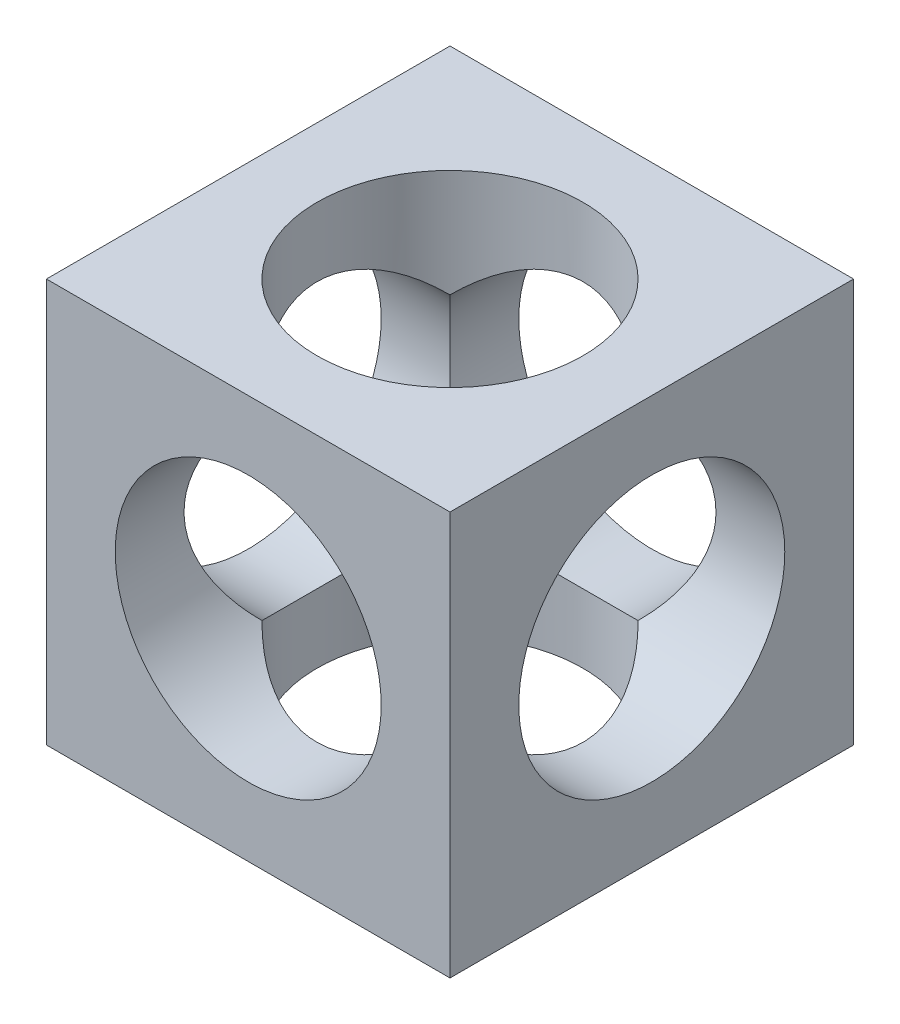
ISO-10303-21;
HEADER;
FILE_DESCRIPTION(('STEP AP214'),'2;1');
FILE_NAME('part.step','',(''),(''),'','','');
FILE_SCHEMA(('AUTOMOTIVE_DESIGN { 1 0 10303 214 1 1 1 1 }'));
ENDSEC;
DATA;
#1=APPLICATION_CONTEXT('core data for automotive mechanical design processes');
#2=APPLICATION_PROTOCOL_DEFINITION('international standard','automotive_design',2000,#1);
#3=PRODUCT_CONTEXT('',#1,'mechanical');
#4=PRODUCT('Part','Part','',(#3));
#5=PRODUCT_RELATED_PRODUCT_CATEGORY('part','',(#4));
#6=PRODUCT_DEFINITION_FORMATION('','',#4);
#7=PRODUCT_DEFINITION_CONTEXT('part definition',#1,'design');
#8=PRODUCT_DEFINITION('design','',#6,#7);
#9=PRODUCT_DEFINITION_SHAPE('','',#8);
#10=(LENGTH_UNIT() NAMED_UNIT(*) SI_UNIT(.MILLI.,.METRE.));
#11=(NAMED_UNIT(*) PLANE_ANGLE_UNIT() SI_UNIT($,.RADIAN.));
#12=(NAMED_UNIT(*) SI_UNIT($,.STERADIAN.) SOLID_ANGLE_UNIT());
#13=UNCERTAINTY_MEASURE_WITH_UNIT(LENGTH_MEASURE(1.E-05),#10,'distance_accuracy_value','');
#14=(GEOMETRIC_REPRESENTATION_CONTEXT(3) GLOBAL_UNCERTAINTY_ASSIGNED_CONTEXT((#13)) GLOBAL_UNIT_ASSIGNED_CONTEXT((#10,
#11,#12)) REPRESENTATION_CONTEXT('',''));
#15=CARTESIAN_POINT('',(0.,0.,0.));
#16=DIRECTION('',(0.,0.,1.));
#17=DIRECTION('',(1.,0.,0.));
#18=AXIS2_PLACEMENT_3D('',#15,#16,#17);
#19=CARTESIAN_POINT('',(-11.,11.,22.));
#20=DIRECTION('',(0.,-1.,0.));
#21=DIRECTION('',(0.,0.,-1.));
#22=AXIS2_PLACEMENT_3D('',#19,#20,#21);
#23=PLANE('',#22);
#24=DIRECTION('',(-1.,0.,0.));
#25=VECTOR('',#24,1.);
#26=CARTESIAN_POINT('',(-11.,11.,0.));
#27=LINE('',#26,#25);
#28=CARTESIAN_POINT('',(11.,11.,0.));
#29=VERTEX_POINT('',#28);
#30=CARTESIAN_POINT('',(-11.,11.,0.));
#31=VERTEX_POINT('',#30);
#32=EDGE_CURVE('E138',#29,#31,#27,.T.);
#33=ORIENTED_EDGE('',*,*,#32,.T.);
#34=DIRECTION('',(0.,0.,-1.));
#35=VECTOR('',#34,1.);
#36=CARTESIAN_POINT('',(-11.,11.,22.));
#37=LINE('',#36,#35);
#38=CARTESIAN_POINT('',(-11.,11.,22.));
#39=VERTEX_POINT('',#38);
#40=EDGE_CURVE('E123',#39,#31,#37,.T.);
#41=ORIENTED_EDGE('',*,*,#40,.F.);
#42=DIRECTION('',(-1.,0.,0.));
#43=VECTOR('',#42,1.);
#44=CARTESIAN_POINT('',(-11.,11.,22.));
#45=LINE('',#44,#43);
#46=CARTESIAN_POINT('',(11.,11.,22.));
#47=VERTEX_POINT('',#46);
#48=EDGE_CURVE('E147',#47,#39,#45,.T.);
#49=ORIENTED_EDGE('',*,*,#48,.F.);
#50=DIRECTION('',(0.,0.,-1.));
#51=VECTOR('',#50,1.);
#52=CARTESIAN_POINT('',(11.,11.,22.));
#53=LINE('',#52,#51);
#54=EDGE_CURVE('E120',#47,#29,#53,.T.);
#55=ORIENTED_EDGE('',*,*,#54,.T.);
#56=EDGE_LOOP('',(#33,#41,#49,#55));
#57=FACE_BOUND('',#56,.T.);
#58=CARTESIAN_POINT('',(0.,11.,11.));
#59=DIRECTION('',(0.,1.,0.));
#60=DIRECTION('',(0.,0.,1.));
#61=AXIS2_PLACEMENT_3D('',#58,#59,#60);
#62=CIRCLE('',#61,7.25);
#63=CARTESIAN_POINT('',(0.,11.,18.25));
#64=VERTEX_POINT('',#63);
#65=EDGE_CURVE('E174',#64,#64,#62,.T.);
#66=ORIENTED_EDGE('',*,*,#65,.F.);
#67=EDGE_LOOP('',(#66));
#68=FACE_BOUND('',#67,.T.);
#69=ADVANCED_FACE('F32',(#57,#68),#23,.F.);
#70=CARTESIAN_POINT('',(11.,0.,11.));
#71=DIRECTION('',(1.,0.,0.));
#72=DIRECTION('',(0.,0.,-1.));
#73=AXIS2_PLACEMENT_3D('',#70,#71,#72);
#74=CYLINDRICAL_SURFACE('',#73,7.25);
#75=CARTESIAN_POINT('',(11.,0.,11.));
#76=DIRECTION('',(1.,0.,0.));
#77=DIRECTION('',(0.,0.,-1.));
#78=AXIS2_PLACEMENT_3D('',#75,#76,#77);
#79=CIRCLE('',#78,7.25);
#80=CARTESIAN_POINT('',(11.,0.,3.75));
#81=VERTEX_POINT('',#80);
#82=EDGE_CURVE('E153',#81,#81,#79,.T.);
#83=ORIENTED_EDGE('',*,*,#82,.T.);
#84=EDGE_LOOP('',(#83));
#85=FACE_BOUND('',#84,.T.);
#86=CARTESIAN_POINT('',(0.,0.,11.));
#87=DIRECTION('',(0.707106781186547,0.,0.707106781186547));
#88=DIRECTION('',(0.707106781186547,0.,-0.707106781186547));
#89=AXIS2_PLACEMENT_3D('',#86,#87,#88);
#90=ELLIPSE('',#89,10.2530483272049,7.25);
#91=CARTESIAN_POINT('',(5.12652416360253,5.12652416360253,5.87347583639757));
#92=VERTEX_POINT('',#91);
#93=CARTESIAN_POINT('',(5.1265241636025,-5.1265241636025,5.87347583639759));
#94=VERTEX_POINT('',#93);
#95=EDGE_CURVE('E101',#92,#94,#90,.F.);
#96=ORIENTED_EDGE('',*,*,#95,.T.);
#97=CARTESIAN_POINT('',(0.,0.,11.));
#98=DIRECTION('',(0.707106781186547,0.707106781186547,0.));
#99=DIRECTION('',(0.707106781186547,-0.707106781186547,0.));
#100=AXIS2_PLACEMENT_3D('',#97,#98,#99);
#101=ELLIPSE('',#100,10.2530483272049,7.25);
#102=CARTESIAN_POINT('',(5.12652416360256,-5.12652416360238,16.1265241636025));
#103=VERTEX_POINT('',#102);
#104=EDGE_CURVE('E165',#94,#103,#101,.F.);
#105=ORIENTED_EDGE('',*,*,#104,.T.);
#106=CARTESIAN_POINT('',(0.,0.,11.));
#107=DIRECTION('',(0.707106781186547,0.,-0.707106781186547));
#108=DIRECTION('',(0.707106781186547,0.,0.707106781186547));
#109=AXIS2_PLACEMENT_3D('',#106,#107,#108);
#110=ELLIPSE('',#109,10.2530483272049,7.25);
#111=CARTESIAN_POINT('',(5.12652416360254,5.12652416360253,16.1265241636024));
#112=VERTEX_POINT('',#111);
#113=EDGE_CURVE('E116',#103,#112,#110,.F.);
#114=ORIENTED_EDGE('',*,*,#113,.T.);
#115=CARTESIAN_POINT('',(0.,0.,11.));
#116=DIRECTION('',(0.707106781186547,-0.707106781186547,0.));
#117=DIRECTION('',(0.707106781186547,0.707106781186547,0.));
#118=AXIS2_PLACEMENT_3D('',#115,#116,#117);
#119=ELLIPSE('',#118,10.2530483272049,7.25);
#120=EDGE_CURVE('E54',#112,#92,#119,.F.);
#121=ORIENTED_EDGE('',*,*,#120,.T.);
#122=EDGE_LOOP('',(#96,#105,#114,#121));
#123=FACE_BOUND('',#122,.T.);
#124=ADVANCED_FACE('F180',(#85,#123),#74,.F.);
#125=CARTESIAN_POINT('',(0.,0.,22.));
#126=DIRECTION('',(0.,0.,-1.));
#127=DIRECTION('',(-1.,0.,0.));
#128=AXIS2_PLACEMENT_3D('',#125,#126,#127);
#129=PLANE('',#128);
#130=DIRECTION('',(0.,1.,0.));
#131=VECTOR('',#130,1.);
#132=CARTESIAN_POINT('',(11.,-11.,22.));
#133=LINE('',#132,#131);
#134=CARTESIAN_POINT('',(11.,-11.,22.));
#135=VERTEX_POINT('',#134);
#136=EDGE_CURVE('E135',#135,#47,#133,.T.);
#137=ORIENTED_EDGE('',*,*,#136,.T.);
#138=ORIENTED_EDGE('',*,*,#48,.T.);
#139=DIRECTION('',(0.,-1.,0.));
#140=VECTOR('',#139,1.);
#141=CARTESIAN_POINT('',(-11.,-11.,22.));
#142=LINE('',#141,#140);
#143=CARTESIAN_POINT('',(-11.,-11.,22.));
#144=VERTEX_POINT('',#143);
#145=EDGE_CURVE('E145',#39,#144,#142,.T.);
#146=ORIENTED_EDGE('',*,*,#145,.T.);
#147=DIRECTION('',(1.,0.,0.));
#148=VECTOR('',#147,1.);
#149=CARTESIAN_POINT('',(-11.,-11.,22.));
#150=LINE('',#149,#148);
#151=EDGE_CURVE('E132',#144,#135,#150,.T.);
#152=ORIENTED_EDGE('',*,*,#151,.T.);
#153=EDGE_LOOP('',(#137,#138,#146,#152));
#154=FACE_BOUND('',#153,.T.);
#155=CARTESIAN_POINT('',(0.,0.,22.));
#156=DIRECTION('',(0.,0.,1.));
#157=DIRECTION('',(1.,0.,0.));
#158=AXIS2_PLACEMENT_3D('',#155,#156,#157);
#159=CIRCLE('',#158,7.25);
#160=CARTESIAN_POINT('',(7.2500000000001,0.,22.));
#161=VERTEX_POINT('',#160);
#162=EDGE_CURVE('E159',#161,#161,#159,.T.);
#163=ORIENTED_EDGE('',*,*,#162,.F.);
#164=EDGE_LOOP('',(#163));
#165=FACE_BOUND('',#164,.T.);
#166=ADVANCED_FACE('F185',(#154,#165),#129,.F.);
#167=CARTESIAN_POINT('',(11.,-11.,22.));
#168=DIRECTION('',(-1.,0.,0.));
#169=DIRECTION('',(0.,0.,1.));
#170=AXIS2_PLACEMENT_3D('',#167,#168,#169);
#171=PLANE('',#170);
#172=DIRECTION('',(0.,1.,0.));
#173=VECTOR('',#172,1.);
#174=CARTESIAN_POINT('',(11.,-11.,0.));
#175=LINE('',#174,#173);
#176=CARTESIAN_POINT('',(11.,-11.,0.));
#177=VERTEX_POINT('',#176);
#178=EDGE_CURVE('E140',#177,#29,#175,.T.);
#179=ORIENTED_EDGE('',*,*,#178,.T.);
#180=ORIENTED_EDGE('',*,*,#54,.F.);
#181=ORIENTED_EDGE('',*,*,#136,.F.);
#182=DIRECTION('',(0.,0.,-1.));
#183=VECTOR('',#182,1.);
#184=CARTESIAN_POINT('',(11.,-11.,22.));
#185=LINE('',#184,#183);
#186=EDGE_CURVE('E129',#135,#177,#185,.T.);
#187=ORIENTED_EDGE('',*,*,#186,.T.);
#188=EDGE_LOOP('',(#179,#180,#181,#187));
#189=FACE_BOUND('',#188,.T.);
#190=ORIENTED_EDGE('',*,*,#82,.F.);
#191=EDGE_LOOP('',(#190));
#192=FACE_BOUND('',#191,.T.);
#193=ADVANCED_FACE('F34',(#189,#192),#171,.F.);
#194=CARTESIAN_POINT('',(-11.,-11.,22.));
#195=DIRECTION('',(1.,0.,0.));
#196=DIRECTION('',(0.,0.,-1.));
#197=AXIS2_PLACEMENT_3D('',#194,#195,#196);
#198=PLANE('',#197);
#199=CARTESIAN_POINT('',(-11.,0.,11.));
#200=DIRECTION('',(1.,0.,0.));
#201=DIRECTION('',(0.,0.,-1.));
#202=AXIS2_PLACEMENT_3D('',#199,#200,#201);
#203=CIRCLE('',#202,7.25);
#204=CARTESIAN_POINT('',(-11.,0.,3.75));
#205=VERTEX_POINT('',#204);
#206=EDGE_CURVE('E143',#205,#205,#203,.T.);
#207=ORIENTED_EDGE('',*,*,#206,.T.);
#208=EDGE_LOOP('',(#207));
#209=FACE_BOUND('',#208,.T.);
#210=DIRECTION('',(0.,-1.,0.));
#211=VECTOR('',#210,1.);
#212=CARTESIAN_POINT('',(-11.,-11.,0.));
#213=LINE('',#212,#211);
#214=CARTESIAN_POINT('',(-11.,-11.,0.));
#215=VERTEX_POINT('',#214);
#216=EDGE_CURVE('E136',#31,#215,#213,.T.);
#217=ORIENTED_EDGE('',*,*,#216,.T.);
#218=DIRECTION('',(0.,0.,-1.));
#219=VECTOR('',#218,1.);
#220=CARTESIAN_POINT('',(-11.,-11.,22.));
#221=LINE('',#220,#219);
#222=EDGE_CURVE('E126',#144,#215,#221,.T.);
#223=ORIENTED_EDGE('',*,*,#222,.F.);
#224=ORIENTED_EDGE('',*,*,#145,.F.);
#225=ORIENTED_EDGE('',*,*,#40,.T.);
#226=EDGE_LOOP('',(#217,#223,#224,#225));
#227=FACE_BOUND('',#226,.T.);
#228=ADVANCED_FACE('F189',(#209,#227),#198,.F.);
#229=CARTESIAN_POINT('',(-11.,-11.,22.));
#230=DIRECTION('',(0.,1.,0.));
#231=DIRECTION('',(0.,0.,1.));
#232=AXIS2_PLACEMENT_3D('',#229,#230,#231);
#233=PLANE('',#232);
#234=CARTESIAN_POINT('',(0.,-11.,11.));
#235=DIRECTION('',(0.,1.,0.));
#236=DIRECTION('',(0.,0.,1.));
#237=AXIS2_PLACEMENT_3D('',#234,#235,#236);
#238=CIRCLE('',#237,7.25);
#239=CARTESIAN_POINT('',(0.,-11.,18.25));
#240=VERTEX_POINT('',#239);
#241=EDGE_CURVE('E110',#240,#240,#238,.T.);
#242=ORIENTED_EDGE('',*,*,#241,.T.);
#243=EDGE_LOOP('',(#242));
#244=FACE_BOUND('',#243,.T.);
#245=DIRECTION('',(1.,0.,0.));
#246=VECTOR('',#245,1.);
#247=CARTESIAN_POINT('',(-11.,-11.,0.));
#248=LINE('',#247,#246);
#249=EDGE_CURVE('E133',#215,#177,#248,.T.);
#250=ORIENTED_EDGE('',*,*,#249,.T.);
#251=ORIENTED_EDGE('',*,*,#186,.F.);
#252=ORIENTED_EDGE('',*,*,#151,.F.);
#253=ORIENTED_EDGE('',*,*,#222,.T.);
#254=EDGE_LOOP('',(#250,#251,#252,#253));
#255=FACE_BOUND('',#254,.T.);
#256=ADVANCED_FACE('F192',(#244,#255),#233,.F.);
#257=CARTESIAN_POINT('',(0.,0.,0.));
#258=DIRECTION('',(0.,0.,-1.));
#259=DIRECTION('',(-1.,0.,0.));
#260=AXIS2_PLACEMENT_3D('',#257,#258,#259);
#261=PLANE('',#260);
#262=CARTESIAN_POINT('',(0.,0.,0.));
#263=DIRECTION('',(0.,0.,-1.));
#264=DIRECTION('',(-1.,0.,0.));
#265=AXIS2_PLACEMENT_3D('',#262,#263,#264);
#266=CIRCLE('',#265,7.25);
#267=CARTESIAN_POINT('',(-7.2499999999999,0.,0.));
#268=VERTEX_POINT('',#267);
#269=EDGE_CURVE('E156',#268,#268,#266,.T.);
#270=ORIENTED_EDGE('',*,*,#269,.F.);
#271=EDGE_LOOP('',(#270));
#272=FACE_BOUND('',#271,.T.);
#273=ORIENTED_EDGE('',*,*,#178,.F.);
#274=ORIENTED_EDGE('',*,*,#249,.F.);
#275=ORIENTED_EDGE('',*,*,#216,.F.);
#276=ORIENTED_EDGE('',*,*,#32,.F.);
#277=EDGE_LOOP('',(#273,#274,#275,#276));
#278=FACE_BOUND('',#277,.T.);
#279=ADVANCED_FACE('F196',(#272,#278),#261,.T.);
#280=CARTESIAN_POINT('',(0.,0.,11.));
#281=DIRECTION('',(0.707106781186547,0.,-0.707106781186547));
#282=DIRECTION('',(0.707106781186547,0.,0.707106781186547));
#283=AXIS2_PLACEMENT_3D('',#280,#281,#282);
#284=ELLIPSE('',#283,10.2530483272049,7.25);
#285=CARTESIAN_POINT('',(-5.12652416360241,-5.12652416360241,5.87347583639749));
#286=VERTEX_POINT('',#285);
#287=CARTESIAN_POINT('',(-5.12652416360243,5.12652416360243,5.87347583639747));
#288=VERTEX_POINT('',#287);
#289=EDGE_CURVE('E109',#286,#288,#284,.T.);
#290=ORIENTED_EDGE('',*,*,#289,.T.);
#291=CARTESIAN_POINT('',(0.,0.,11.));
#292=DIRECTION('',(0.707106781186547,0.707106781186547,0.));
#293=DIRECTION('',(0.707106781186547,-0.707106781186547,0.));
#294=AXIS2_PLACEMENT_3D('',#291,#292,#293);
#295=ELLIPSE('',#294,10.2530483272049,7.25);
#296=CARTESIAN_POINT('',(-5.12652416360237,5.12652416360255,16.1265241636025));
#297=VERTEX_POINT('',#296);
#298=EDGE_CURVE('E95',#288,#297,#295,.T.);
#299=ORIENTED_EDGE('',*,*,#298,.T.);
#300=CARTESIAN_POINT('',(0.,0.,11.));
#301=DIRECTION('',(0.707106781186547,0.,0.707106781186547));
#302=DIRECTION('',(0.707106781186547,0.,-0.707106781186547));
#303=AXIS2_PLACEMENT_3D('',#300,#301,#302);
#304=ELLIPSE('',#303,10.2530483272049,7.25);
#305=CARTESIAN_POINT('',(-5.12652416360239,-5.12652416360241,16.1265241636025));
#306=VERTEX_POINT('',#305);
#307=EDGE_CURVE('E107',#297,#306,#304,.T.);
#308=ORIENTED_EDGE('',*,*,#307,.T.);
#309=CARTESIAN_POINT('',(0.,0.,11.));
#310=DIRECTION('',(0.707106781186547,-0.707106781186547,0.));
#311=DIRECTION('',(0.707106781186547,0.707106781186547,0.));
#312=AXIS2_PLACEMENT_3D('',#309,#310,#311);
#313=ELLIPSE('',#312,10.2530483272049,7.25);
#314=EDGE_CURVE('E47',#306,#286,#313,.T.);
#315=ORIENTED_EDGE('',*,*,#314,.T.);
#316=EDGE_LOOP('',(#290,#299,#308,#315));
#317=FACE_BOUND('',#316,.T.);
#318=ORIENTED_EDGE('',*,*,#206,.F.);
#319=EDGE_LOOP('',(#318));
#320=FACE_BOUND('',#319,.T.);
#321=ADVANCED_FACE('F105',(#317,#320),#74,.F.);
#322=CARTESIAN_POINT('',(0.,0.,22.));
#323=DIRECTION('',(0.,0.,1.));
#324=DIRECTION('',(1.,0.,0.));
#325=AXIS2_PLACEMENT_3D('',#322,#323,#324);
#326=CYLINDRICAL_SURFACE('',#325,7.25);
#327=ORIENTED_EDGE('',*,*,#269,.T.);
#328=EDGE_LOOP('',(#327));
#329=FACE_BOUND('',#328,.T.);
#330=ORIENTED_EDGE('',*,*,#95,.F.);
#331=CARTESIAN_POINT('',(0.,0.,11.));
#332=DIRECTION('',(0.,0.707106781186547,0.707106781186547));
#333=DIRECTION('',(0.,-0.707106781186547,0.707106781186547));
#334=AXIS2_PLACEMENT_3D('',#331,#332,#333);
#335=ELLIPSE('',#334,10.2530483272049,7.25);
#336=EDGE_CURVE('E169',#92,#288,#335,.T.);
#337=ORIENTED_EDGE('',*,*,#336,.T.);
#338=ORIENTED_EDGE('',*,*,#289,.F.);
#339=CARTESIAN_POINT('',(0.,0.,11.));
#340=DIRECTION('',(0.,-0.707106781186547,0.707106781186547));
#341=DIRECTION('',(0.,0.707106781186547,0.707106781186547));
#342=AXIS2_PLACEMENT_3D('',#339,#340,#341);
#343=ELLIPSE('',#342,10.2530483272049,7.25);
#344=EDGE_CURVE('E162',#286,#94,#343,.T.);
#345=ORIENTED_EDGE('',*,*,#344,.T.);
#346=EDGE_LOOP('',(#330,#337,#338,#345));
#347=FACE_BOUND('',#346,.T.);
#348=ADVANCED_FACE('F205',(#329,#347),#326,.F.);
#349=ORIENTED_EDGE('',*,*,#162,.T.);
#350=EDGE_LOOP('',(#349));
#351=FACE_BOUND('',#350,.T.);
#352=ORIENTED_EDGE('',*,*,#113,.F.);
#353=CARTESIAN_POINT('',(0.,0.,11.));
#354=DIRECTION('',(0.,0.707106781186547,0.707106781186547));
#355=DIRECTION('',(0.,-0.707106781186547,0.707106781186547));
#356=AXIS2_PLACEMENT_3D('',#353,#354,#355);
#357=ELLIPSE('',#356,10.2530483272049,7.25);
#358=EDGE_CURVE('E11',#103,#306,#357,.F.);
#359=ORIENTED_EDGE('',*,*,#358,.T.);
#360=ORIENTED_EDGE('',*,*,#307,.F.);
#361=CARTESIAN_POINT('',(0.,0.,11.));
#362=DIRECTION('',(0.,-0.707106781186547,0.707106781186547));
#363=DIRECTION('',(0.,0.707106781186547,0.707106781186547));
#364=AXIS2_PLACEMENT_3D('',#361,#362,#363);
#365=ELLIPSE('',#364,10.2530483272049,7.25);
#366=EDGE_CURVE('E40',#297,#112,#365,.F.);
#367=ORIENTED_EDGE('',*,*,#366,.T.);
#368=EDGE_LOOP('',(#352,#359,#360,#367));
#369=FACE_BOUND('',#368,.T.);
#370=ADVANCED_FACE('F112',(#351,#369),#326,.F.);
#371=CARTESIAN_POINT('',(0.,11.,11.));
#372=DIRECTION('',(0.,1.,0.));
#373=DIRECTION('',(0.,0.,1.));
#374=AXIS2_PLACEMENT_3D('',#371,#372,#373);
#375=CYLINDRICAL_SURFACE('',#374,7.25);
#376=ORIENTED_EDGE('',*,*,#241,.F.);
#377=EDGE_LOOP('',(#376));
#378=FACE_BOUND('',#377,.T.);
#379=ORIENTED_EDGE('',*,*,#314,.F.);
#380=ORIENTED_EDGE('',*,*,#358,.F.);
#381=ORIENTED_EDGE('',*,*,#104,.F.);
#382=ORIENTED_EDGE('',*,*,#344,.F.);
#383=EDGE_LOOP('',(#379,#380,#381,#382));
#384=FACE_BOUND('',#383,.T.);
#385=ADVANCED_FACE('F209',(#378,#384),#375,.F.);
#386=ORIENTED_EDGE('',*,*,#65,.T.);
#387=EDGE_LOOP('',(#386));
#388=FACE_BOUND('',#387,.T.);
#389=ORIENTED_EDGE('',*,*,#120,.F.);
#390=ORIENTED_EDGE('',*,*,#366,.F.);
#391=ORIENTED_EDGE('',*,*,#298,.F.);
#392=ORIENTED_EDGE('',*,*,#336,.F.);
#393=EDGE_LOOP('',(#389,#390,#391,#392));
#394=FACE_BOUND('',#393,.T.);
#395=ADVANCED_FACE('F94',(#388,#394),#375,.F.);
#396=CLOSED_SHELL('',(#69,#124,#166,#193,#228,#256,#279,#321,#348,#370,#385,#395));
#397=MANIFOLD_SOLID_BREP('B2',#396);
#398=ADVANCED_BREP_SHAPE_REPRESENTATION('',(#18,#397),#14);
#399=SHAPE_DEFINITION_REPRESENTATION(#9,#398);
ENDSEC;
END-ISO-10303-21;
